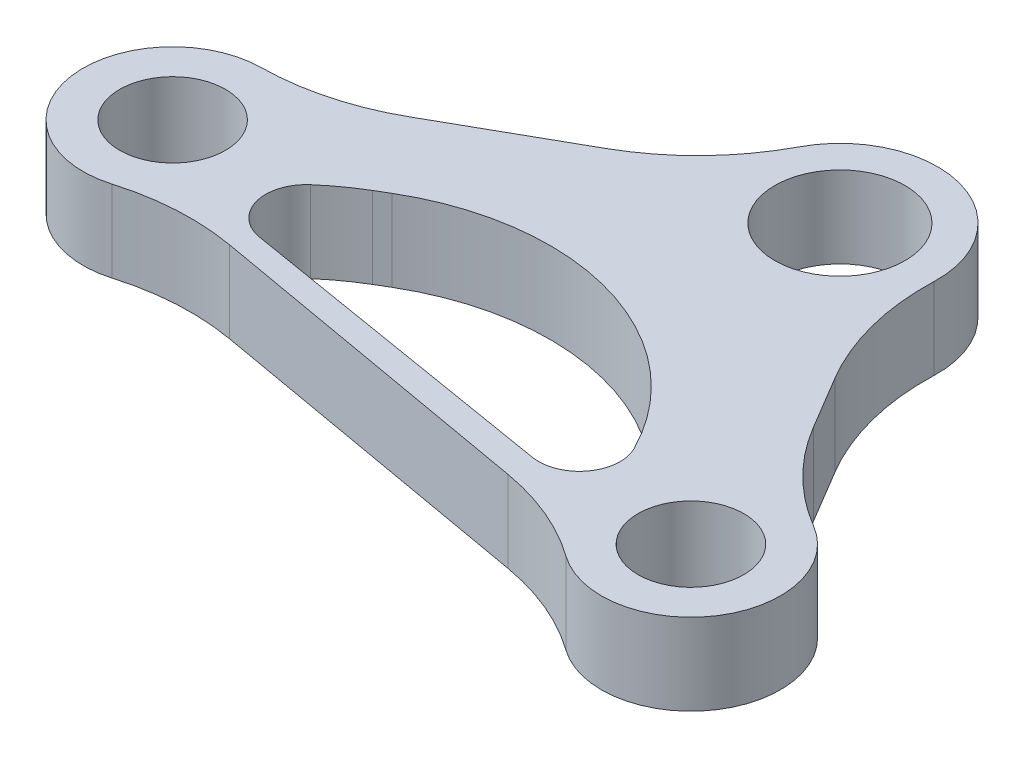
ISO-10303-21;
HEADER;
FILE_DESCRIPTION(('STEP AP214'),'2;1');
FILE_NAME('part.step','',(''),(''),'','','');
FILE_SCHEMA(('AUTOMOTIVE_DESIGN { 1 0 10303 214 1 1 1 1 }'));
ENDSEC;
DATA;
#1=APPLICATION_CONTEXT('core data for automotive mechanical design processes');
#2=APPLICATION_PROTOCOL_DEFINITION('international standard','automotive_design',2000,#1);
#3=PRODUCT_CONTEXT('',#1,'mechanical');
#4=PRODUCT('Part','Part','',(#3));
#5=PRODUCT_RELATED_PRODUCT_CATEGORY('part','',(#4));
#6=PRODUCT_DEFINITION_FORMATION('','',#4);
#7=PRODUCT_DEFINITION_CONTEXT('part definition',#1,'design');
#8=PRODUCT_DEFINITION('design','',#6,#7);
#9=PRODUCT_DEFINITION_SHAPE('','',#8);
#10=(LENGTH_UNIT() NAMED_UNIT(*) SI_UNIT(.MILLI.,.METRE.));
#11=(NAMED_UNIT(*) PLANE_ANGLE_UNIT() SI_UNIT($,.RADIAN.));
#12=(NAMED_UNIT(*) SI_UNIT($,.STERADIAN.) SOLID_ANGLE_UNIT());
#13=UNCERTAINTY_MEASURE_WITH_UNIT(LENGTH_MEASURE(1.E-05),#10,'distance_accuracy_value','');
#14=(GEOMETRIC_REPRESENTATION_CONTEXT(3) GLOBAL_UNCERTAINTY_ASSIGNED_CONTEXT((#13)) GLOBAL_UNIT_ASSIGNED_CONTEXT((#10,
#11,#12)) REPRESENTATION_CONTEXT('',''));
#15=CARTESIAN_POINT('',(0.,0.,0.));
#16=DIRECTION('',(0.,0.,1.));
#17=DIRECTION('',(1.,0.,0.));
#18=AXIS2_PLACEMENT_3D('',#15,#16,#17);
#19=CARTESIAN_POINT('',(39.2520973383795,10.,21.4894902294481));
#20=DIRECTION('',(0.,1.,0.));
#21=DIRECTION('',(0.,0.,1.));
#22=AXIS2_PLACEMENT_3D('',#19,#20,#21);
#23=PLANE('',#22);
#24=CARTESIAN_POINT('',(14.2520948776002,10.,-21.8117785390374));
#25=DIRECTION('',(0.,1.,0.));
#26=DIRECTION('',(0.,0.,1.));
#27=AXIS2_PLACEMENT_3D('',#24,#25,#26);
#28=CIRCLE('',#27,7.9999999999151);
#29=CARTESIAN_POINT('',(14.2520948776002,10.,-13.8117785391223));
#30=VERTEX_POINT('',#29);
#31=EDGE_CURVE('E623',#30,#30,#28,.T.);
#32=ORIENTED_EDGE('',*,*,#31,.F.);
#33=EDGE_LOOP('',(#32));
#34=FACE_BOUND('',#33,.T.);
#35=CARTESIAN_POINT('',(-1.16729566506993,10.,28.3650025181763));
#36=DIRECTION('',(0.,1.,0.));
#37=DIRECTION('',(0.,0.,1.));
#38=AXIS2_PLACEMENT_3D('',#35,#36,#37);
#39=CIRCLE('',#38,29.9999999994644);
#40=CARTESIAN_POINT('',(25.5899191802422,10.,14.7984460763347));
#41=VERTEX_POINT('',#40);
#42=CARTESIAN_POINT('',(-16.4342386361067,10.,2.54019947368099));
#43=VERTEX_POINT('',#42);
#44=EDGE_CURVE('E174',#41,#43,#39,.T.);
#45=ORIENTED_EDGE('',*,*,#44,.F.);
#46=CARTESIAN_POINT('',(21.130383372617,10.,17.0595388166787));
#47=DIRECTION('',(0.,1.,0.));
#48=DIRECTION('',(0.,0.,1.));
#49=AXIS2_PLACEMENT_3D('',#46,#47,#48);
#50=CIRCLE('',#49,4.99999999999279);
#51=CARTESIAN_POINT('',(20.3127049619111,10.,21.9922259156739));
#52=VERTEX_POINT('',#51);
#53=EDGE_CURVE('E165',#52,#41,#50,.T.);
#54=ORIENTED_EDGE('',*,*,#53,.F.);
#55=DIRECTION('',(0.986537419800459,0.,0.163535682141402));
#56=VECTOR('',#55,1.);
#57=CARTESIAN_POINT('',(20.3127049619111,10.,21.9922259156739));
#58=LINE('',#57,#56);
#59=CARTESIAN_POINT('',(-19.8914129584531,10.,15.327696302261));
#60=VERTEX_POINT('',#59);
#61=EDGE_CURVE('E202',#60,#52,#58,.T.);
#62=ORIENTED_EDGE('',*,*,#61,.F.);
#63=CARTESIAN_POINT('',(-19.0737345477473,10.,10.3950092032658));
#64=DIRECTION('',(0.,1.,0.));
#65=DIRECTION('',(0.,0.,1.));
#66=AXIS2_PLACEMENT_3D('',#63,#64,#65);
#67=CIRCLE('',#66,4.99999999999279);
#68=CARTESIAN_POINT('',(-22.3597920677756,10.,6.6264781930453));
#69=VERTEX_POINT('',#68);
#70=EDGE_CURVE('E199',#69,#60,#67,.T.);
#71=ORIENTED_EDGE('',*,*,#70,.F.);
#72=CARTESIAN_POINT('',(-2.64344694792927,10.,29.237664253997));
#73=DIRECTION('',(0.,1.,0.));
#74=DIRECTION('',(0.,0.,1.));
#75=AXIS2_PLACEMENT_3D('',#72,#73,#74);
#76=CIRCLE('',#75,29.9999999994644);
#77=CARTESIAN_POINT('',(-17.9103899189661,10.,3.4128612095017));
#78=VERTEX_POINT('',#77);
#79=EDGE_CURVE('E193',#78,#69,#76,.T.);
#80=ORIENTED_EDGE('',*,*,#79,.F.);
#81=DIRECTION('',(-0.860826768165212,0.,0.508898099043647));
#82=VECTOR('',#81,1.);
#83=CARTESIAN_POINT('',(-16.4342386361067,10.,2.54019947368101));
#84=LINE('',#83,#82);
#85=EDGE_CURVE('E189',#43,#78,#84,.T.);
#86=ORIENTED_EDGE('',*,*,#85,.F.);
#87=EDGE_LOOP('',(#45,#54,#62,#71,#80,#86));
#88=FACE_BOUND('',#87,.T.);
#89=CARTESIAN_POINT('',(39.2520973383795,10.,21.4894902294481));
#90=DIRECTION('',(0.,1.,0.));
#91=DIRECTION('',(0.,0.,1.));
#92=AXIS2_PLACEMENT_3D('',#89,#90,#91);
#93=CIRCLE('',#92,11.0000000000008);
#94=CARTESIAN_POINT('',(32.8589202459216,10.,30.4408748522028));
#95=VERTEX_POINT('',#94);
#96=CARTESIAN_POINT('',(44.8540194417173,10.,12.0227870679376));
#97=VERTEX_POINT('',#96);
#98=EDGE_CURVE('E237',#95,#97,#93,.T.);
#99=ORIENTED_EDGE('',*,*,#98,.T.);
#100=CARTESIAN_POINT('',(60.131988814183,10.,-13.7954942811737));
#101=DIRECTION('',(0.,-1.,0.));
#102=DIRECTION('',(0.,0.,1.));
#103=AXIS2_PLACEMENT_3D('',#100,#101,#102);
#104=CIRCLE('',#103,29.9999999994644);
#105=CARTESIAN_POINT('',(34.3608541908364,10.,1.56186943117008));
#106=VERTEX_POINT('',#105);
#107=EDGE_CURVE('E241',#97,#106,#104,.T.);
#108=ORIENTED_EDGE('',*,*,#107,.T.);
#109=DIRECTION('',(-0.51191212375393,0.,-0.859037820793556));
#110=VECTOR('',#109,1.);
#111=CARTESIAN_POINT('',(34.3608541908364,10.,1.56186943117008));
#112=LINE('',#111,#110);
#113=CARTESIAN_POINT('',(30.4554825745975,10.,-4.99172007556231));
#114=VERTEX_POINT('',#113);
#115=EDGE_CURVE('E245',#106,#114,#112,.T.);
#116=ORIENTED_EDGE('',*,*,#115,.T.);
#117=CARTESIAN_POINT('',(56.2266171979442,10.,-20.3490837879059));
#118=DIRECTION('',(0.,-1.,0.));
#119=DIRECTION('',(0.,0.,1.));
#120=AXIS2_PLACEMENT_3D('',#117,#118,#119);
#121=CIRCLE('',#120,29.9999999994644);
#122=CARTESIAN_POINT('',(26.2448155407173,10.,-21.3938657529942));
#123=VERTEX_POINT('',#122);
#124=EDGE_CURVE('E248',#114,#123,#121,.T.);
#125=ORIENTED_EDGE('',*,*,#124,.T.);
#126=CARTESIAN_POINT('',(14.2520948776002,10.,-21.8117785390374));
#127=DIRECTION('',(0.,1.,0.));
#128=DIRECTION('',(0.,0.,1.));
#129=AXIS2_PLACEMENT_3D('',#126,#127,#128);
#130=CIRCLE('',#129,12.0000000000123);
#131=CARTESIAN_POINT('',(3.64675509158938,10.,-27.4266487978725));
#132=VERTEX_POINT('',#131);
#133=EDGE_CURVE('E251',#123,#132,#130,.T.);
#134=ORIENTED_EDGE('',*,*,#133,.T.);
#135=CARTESIAN_POINT('',(-22.8665943729371,10.,-41.4638244446954));
#136=DIRECTION('',(0.,-1.,0.));
#137=DIRECTION('',(0.,0.,1.));
#138=AXIS2_PLACEMENT_3D('',#135,#136,#137);
#139=CIRCLE('',#138,29.9999999994644);
#140=CARTESIAN_POINT('',(-8.13512740407356,10.,-15.3298641456296));
#141=VERTEX_POINT('',#140);
#142=EDGE_CURVE('E254',#132,#141,#139,.T.);
#143=ORIENTED_EDGE('',*,*,#142,.T.);
#144=DIRECTION('',(-0.871132009984412,0.,0.491048898970885));
#145=VECTOR('',#144,1.);
#146=CARTESIAN_POINT('',(-8.13512740407356,10.,-15.3298641456296));
#147=LINE('',#146,#145);
#148=CARTESIAN_POINT('',(-23.4897269114671,10.,-6.67462120216413));
#149=VERTEX_POINT('',#148);
#150=EDGE_CURVE('E257',#141,#149,#147,.T.);
#151=ORIENTED_EDGE('',*,*,#150,.T.);
#152=CARTESIAN_POINT('',(-38.2211938803307,10.,-32.8085815012299));
#153=DIRECTION('',(0.,-1.,0.));
#154=DIRECTION('',(0.,0.,1.));
#155=AXIS2_PLACEMENT_3D('',#152,#153,#154);
#156=CIRCLE('',#155,29.9999999994644);
#157=CARTESIAN_POINT('',(-37.8467307807555,10.,-2.81091863635123));
#158=VERTEX_POINT('',#157);
#159=EDGE_CURVE('E260',#149,#158,#156,.T.);
#160=ORIENTED_EDGE('',*,*,#159,.T.);
#161=CARTESIAN_POINT('',(-37.7094276442421,10.,8.18822441430147));
#162=DIRECTION('',(0.,1.,0.));
#163=DIRECTION('',(0.,0.,1.));
#164=AXIS2_PLACEMENT_3D('',#161,#162,#163);
#165=CIRCLE('',#164,11.0000000000008);
#166=CARTESIAN_POINT('',(-34.607167770061,10.,18.7417064782017));
#167=VERTEX_POINT('',#166);
#168=EDGE_CURVE('E263',#158,#167,#165,.T.);
#169=ORIENTED_EDGE('',*,*,#168,.T.);
#170=CARTESIAN_POINT('',(-26.1464590224461,10.,47.5239302883227));
#171=DIRECTION('',(0.,-1.,0.));
#172=DIRECTION('',(0.,0.,1.));
#173=AXIS2_PLACEMENT_3D('',#170,#171,#172);
#174=CIRCLE('',#173,29.9999999994644);
#175=CARTESIAN_POINT('',(-20.9370153716465,10.,17.9796974024107));
#176=VERTEX_POINT('',#175);
#177=EDGE_CURVE('E266',#167,#176,#174,.T.);
#178=ORIENTED_EDGE('',*,*,#177,.T.);
#179=DIRECTION('',(0.984807762881317,0.,0.173648121696422));
#180=VECTOR('',#179,1.);
#181=CARTESIAN_POINT('',(-20.9370153716465,10.,17.9796974024107));
#182=LINE('',#181,#180);
#183=CARTESIAN_POINT('',(20.6324263721488,10.,25.3095091188206));
#184=VERTEX_POINT('',#183);
#185=EDGE_CURVE('E269',#176,#184,#182,.T.);
#186=ORIENTED_EDGE('',*,*,#185,.T.);
#187=CARTESIAN_POINT('',(15.4229827213491,10.,54.8537420047326));
#188=DIRECTION('',(0.,-1.,0.));
#189=DIRECTION('',(0.,0.,1.));
#190=AXIS2_PLACEMENT_3D('',#187,#188,#189);
#191=CIRCLE('',#190,29.9999999994644);
#192=EDGE_CURVE('E272',#184,#95,#191,.T.);
#193=ORIENTED_EDGE('',*,*,#192,.T.);
#194=EDGE_LOOP('',(#99,#108,#116,#125,#134,#143,#151,#160,#169,#178,#186,#193));
#195=FACE_BOUND('',#194,.T.);
#196=CARTESIAN_POINT('',(-37.7094276442421,10.,8.18822441430146));
#197=DIRECTION('',(0.,1.,0.));
#198=DIRECTION('',(0.,0.,1.));
#199=AXIS2_PLACEMENT_3D('',#196,#197,#198);
#200=CIRCLE('',#199,6.49999999975905);
#201=CARTESIAN_POINT('',(-37.7094276442421,10.,14.6882244140605));
#202=VERTEX_POINT('',#201);
#203=EDGE_CURVE('E207',#202,#202,#200,.T.);
#204=ORIENTED_EDGE('',*,*,#203,.F.);
#205=EDGE_LOOP('',(#204));
#206=FACE_BOUND('',#205,.T.);
#207=CARTESIAN_POINT('',(39.2520973383795,10.,21.4894902294481));
#208=DIRECTION('',(0.,1.,0.));
#209=DIRECTION('',(0.,0.,1.));
#210=AXIS2_PLACEMENT_3D('',#207,#208,#209);
#211=CIRCLE('',#210,6.50000000022621);
#212=CARTESIAN_POINT('',(39.2520973383795,10.,27.9894902296743));
#213=VERTEX_POINT('',#212);
#214=EDGE_CURVE('E612',#213,#213,#211,.T.);
#215=ORIENTED_EDGE('',*,*,#214,.F.);
#216=EDGE_LOOP('',(#215));
#217=FACE_BOUND('',#216,.T.);
#218=ADVANCED_FACE('F39',(#34,#88,#195,#206,#217),#23,.T.);
#219=CARTESIAN_POINT('',(39.2520973383795,0.,21.4894902294481));
#220=DIRECTION('',(0.,1.,0.));
#221=DIRECTION('',(0.,0.,1.));
#222=AXIS2_PLACEMENT_3D('',#219,#220,#221);
#223=PLANE('',#222);
#224=CARTESIAN_POINT('',(39.2520973383795,0.,21.4894902294481));
#225=DIRECTION('',(0.,1.,0.));
#226=DIRECTION('',(0.,0.,1.));
#227=AXIS2_PLACEMENT_3D('',#224,#225,#226);
#228=CIRCLE('',#227,11.0000000000008);
#229=CARTESIAN_POINT('',(32.8589202459216,0.,30.4408748522028));
#230=VERTEX_POINT('',#229);
#231=CARTESIAN_POINT('',(44.8540194417173,0.,12.0227870679376));
#232=VERTEX_POINT('',#231);
#233=EDGE_CURVE('E183',#230,#232,#228,.T.);
#234=ORIENTED_EDGE('',*,*,#233,.F.);
#235=CARTESIAN_POINT('',(15.4229827213491,0.,54.8537420047326));
#236=DIRECTION('',(0.,-1.,0.));
#237=DIRECTION('',(0.,0.,1.));
#238=AXIS2_PLACEMENT_3D('',#235,#236,#237);
#239=CIRCLE('',#238,29.9999999994644);
#240=CARTESIAN_POINT('',(20.6324263721488,0.,25.3095091188206));
#241=VERTEX_POINT('',#240);
#242=EDGE_CURVE('E242',#241,#230,#239,.T.);
#243=ORIENTED_EDGE('',*,*,#242,.F.);
#244=DIRECTION('',(0.984807762881317,0.,0.173648121696422));
#245=VECTOR('',#244,1.);
#246=CARTESIAN_POINT('',(-20.9370153716465,0.,17.9796974024107));
#247=LINE('',#246,#245);
#248=CARTESIAN_POINT('',(-20.9370153716465,0.,17.9796974024107));
#249=VERTEX_POINT('',#248);
#250=EDGE_CURVE('E306',#249,#241,#247,.T.);
#251=ORIENTED_EDGE('',*,*,#250,.F.);
#252=CARTESIAN_POINT('',(-26.1464590224461,0.,47.5239302883227));
#253=DIRECTION('',(0.,-1.,0.));
#254=DIRECTION('',(0.,0.,1.));
#255=AXIS2_PLACEMENT_3D('',#252,#253,#254);
#256=CIRCLE('',#255,29.9999999994644);
#257=CARTESIAN_POINT('',(-34.607167770061,0.,18.7417064782017));
#258=VERTEX_POINT('',#257);
#259=EDGE_CURVE('E303',#258,#249,#256,.T.);
#260=ORIENTED_EDGE('',*,*,#259,.F.);
#261=CARTESIAN_POINT('',(-37.7094276442421,0.,8.18822441430147));
#262=DIRECTION('',(0.,1.,0.));
#263=DIRECTION('',(0.,0.,1.));
#264=AXIS2_PLACEMENT_3D('',#261,#262,#263);
#265=CIRCLE('',#264,11.0000000000008);
#266=CARTESIAN_POINT('',(-37.8467307807555,0.,-2.81091863635123));
#267=VERTEX_POINT('',#266);
#268=EDGE_CURVE('E300',#267,#258,#265,.T.);
#269=ORIENTED_EDGE('',*,*,#268,.F.);
#270=CARTESIAN_POINT('',(-38.2211938803307,0.,-32.8085815012299));
#271=DIRECTION('',(0.,-1.,0.));
#272=DIRECTION('',(0.,0.,1.));
#273=AXIS2_PLACEMENT_3D('',#270,#271,#272);
#274=CIRCLE('',#273,29.9999999994644);
#275=CARTESIAN_POINT('',(-23.4897269114671,0.,-6.67462120216413));
#276=VERTEX_POINT('',#275);
#277=EDGE_CURVE('E297',#276,#267,#274,.T.);
#278=ORIENTED_EDGE('',*,*,#277,.F.);
#279=DIRECTION('',(-0.871132009984412,0.,0.491048898970885));
#280=VECTOR('',#279,1.);
#281=CARTESIAN_POINT('',(-8.13512740407356,0.,-15.3298641456296));
#282=LINE('',#281,#280);
#283=CARTESIAN_POINT('',(-8.13512740407356,0.,-15.3298641456296));
#284=VERTEX_POINT('',#283);
#285=EDGE_CURVE('E294',#284,#276,#282,.T.);
#286=ORIENTED_EDGE('',*,*,#285,.F.);
#287=CARTESIAN_POINT('',(-22.8665943729371,0.,-41.4638244446954));
#288=DIRECTION('',(0.,-1.,0.));
#289=DIRECTION('',(0.,0.,1.));
#290=AXIS2_PLACEMENT_3D('',#287,#288,#289);
#291=CIRCLE('',#290,29.9999999994644);
#292=CARTESIAN_POINT('',(3.64675509158938,0.,-27.4266487978725));
#293=VERTEX_POINT('',#292);
#294=EDGE_CURVE('E291',#293,#284,#291,.T.);
#295=ORIENTED_EDGE('',*,*,#294,.F.);
#296=CARTESIAN_POINT('',(14.2520948776002,0.,-21.8117785390374));
#297=DIRECTION('',(0.,1.,0.));
#298=DIRECTION('',(0.,0.,1.));
#299=AXIS2_PLACEMENT_3D('',#296,#297,#298);
#300=CIRCLE('',#299,12.0000000000123);
#301=CARTESIAN_POINT('',(26.2448155407173,0.,-21.3938657529942));
#302=VERTEX_POINT('',#301);
#303=EDGE_CURVE('E288',#302,#293,#300,.T.);
#304=ORIENTED_EDGE('',*,*,#303,.F.);
#305=CARTESIAN_POINT('',(56.2266171979442,0.,-20.3490837879059));
#306=DIRECTION('',(0.,-1.,0.));
#307=DIRECTION('',(0.,0.,1.));
#308=AXIS2_PLACEMENT_3D('',#305,#306,#307);
#309=CIRCLE('',#308,29.9999999994644);
#310=CARTESIAN_POINT('',(30.4554825745975,0.,-4.99172007556231));
#311=VERTEX_POINT('',#310);
#312=EDGE_CURVE('E285',#311,#302,#309,.T.);
#313=ORIENTED_EDGE('',*,*,#312,.F.);
#314=DIRECTION('',(-0.51191212375393,0.,-0.859037820793556));
#315=VECTOR('',#314,1.);
#316=CARTESIAN_POINT('',(34.3608541908364,0.,1.56186943117008));
#317=LINE('',#316,#315);
#318=CARTESIAN_POINT('',(34.3608541908364,0.,1.56186943117008));
#319=VERTEX_POINT('',#318);
#320=EDGE_CURVE('E282',#319,#311,#317,.T.);
#321=ORIENTED_EDGE('',*,*,#320,.F.);
#322=CARTESIAN_POINT('',(60.131988814183,0.,-13.7954942811737));
#323=DIRECTION('',(0.,-1.,0.));
#324=DIRECTION('',(0.,0.,1.));
#325=AXIS2_PLACEMENT_3D('',#322,#323,#324);
#326=CIRCLE('',#325,29.9999999994644);
#327=EDGE_CURVE('E279',#232,#319,#326,.T.);
#328=ORIENTED_EDGE('',*,*,#327,.F.);
#329=EDGE_LOOP('',(#234,#243,#251,#260,#269,#278,#286,#295,#304,#313,#321,#328));
#330=FACE_BOUND('',#329,.T.);
#331=CARTESIAN_POINT('',(21.130383372617,0.,17.0595388166787));
#332=DIRECTION('',(0.,1.,0.));
#333=DIRECTION('',(0.,0.,1.));
#334=AXIS2_PLACEMENT_3D('',#331,#332,#333);
#335=CIRCLE('',#334,4.99999999999279);
#336=CARTESIAN_POINT('',(20.3127049619111,0.,21.9922259156739));
#337=VERTEX_POINT('',#336);
#338=CARTESIAN_POINT('',(25.5899191802422,0.,14.7984460763347));
#339=VERTEX_POINT('',#338);
#340=EDGE_CURVE('E63',#337,#339,#335,.T.);
#341=ORIENTED_EDGE('',*,*,#340,.T.);
#342=CARTESIAN_POINT('',(-1.16729566506993,0.,28.3650025181763));
#343=DIRECTION('',(0.,1.,0.));
#344=DIRECTION('',(0.,0.,1.));
#345=AXIS2_PLACEMENT_3D('',#342,#343,#344);
#346=CIRCLE('',#345,29.9999999994644);
#347=CARTESIAN_POINT('',(-16.4342386361067,0.,2.54019947368099));
#348=VERTEX_POINT('',#347);
#349=EDGE_CURVE('E181',#339,#348,#346,.T.);
#350=ORIENTED_EDGE('',*,*,#349,.T.);
#351=DIRECTION('',(-0.860826768165212,0.,0.508898099043647));
#352=VECTOR('',#351,1.);
#353=CARTESIAN_POINT('',(-16.4342386361067,0.,2.54019947368101));
#354=LINE('',#353,#352);
#355=CARTESIAN_POINT('',(-17.9103899189661,0.,3.4128612095017));
#356=VERTEX_POINT('',#355);
#357=EDGE_CURVE('E210',#348,#356,#354,.T.);
#358=ORIENTED_EDGE('',*,*,#357,.T.);
#359=CARTESIAN_POINT('',(-2.64344694792927,0.,29.237664253997));
#360=DIRECTION('',(0.,1.,0.));
#361=DIRECTION('',(0.,0.,1.));
#362=AXIS2_PLACEMENT_3D('',#359,#360,#361);
#363=CIRCLE('',#362,29.9999999994644);
#364=CARTESIAN_POINT('',(-22.3597920677756,0.,6.6264781930453));
#365=VERTEX_POINT('',#364);
#366=EDGE_CURVE('E214',#356,#365,#363,.T.);
#367=ORIENTED_EDGE('',*,*,#366,.T.);
#368=CARTESIAN_POINT('',(-19.0737345477473,0.,10.3950092032658));
#369=DIRECTION('',(0.,1.,0.));
#370=DIRECTION('',(0.,0.,1.));
#371=AXIS2_PLACEMENT_3D('',#368,#369,#370);
#372=CIRCLE('',#371,4.99999999999279);
#373=CARTESIAN_POINT('',(-19.8914129584531,0.,15.3276963022609));
#374=VERTEX_POINT('',#373);
#375=EDGE_CURVE('E218',#365,#374,#372,.T.);
#376=ORIENTED_EDGE('',*,*,#375,.T.);
#377=DIRECTION('',(0.986537419800459,0.,0.163535682141402));
#378=VECTOR('',#377,1.);
#379=CARTESIAN_POINT('',(20.3127049619111,0.,21.9922259156739));
#380=LINE('',#379,#378);
#381=EDGE_CURVE('E175',#374,#337,#380,.T.);
#382=ORIENTED_EDGE('',*,*,#381,.T.);
#383=EDGE_LOOP('',(#341,#350,#358,#367,#376,#382));
#384=FACE_BOUND('',#383,.T.);
#385=CARTESIAN_POINT('',(-37.7094276442421,0.,8.18822441430146));
#386=DIRECTION('',(0.,1.,0.));
#387=DIRECTION('',(0.,0.,1.));
#388=AXIS2_PLACEMENT_3D('',#385,#386,#387);
#389=CIRCLE('',#388,6.49999999975905);
#390=CARTESIAN_POINT('',(-37.7094276442421,0.,14.6882244140605));
#391=VERTEX_POINT('',#390);
#392=EDGE_CURVE('E627',#391,#391,#389,.T.);
#393=ORIENTED_EDGE('',*,*,#392,.T.);
#394=EDGE_LOOP('',(#393));
#395=FACE_BOUND('',#394,.T.);
#396=CARTESIAN_POINT('',(14.2520948776002,0.,-21.8117785390374));
#397=DIRECTION('',(0.,1.,0.));
#398=DIRECTION('',(0.,0.,1.));
#399=AXIS2_PLACEMENT_3D('',#396,#397,#398);
#400=CIRCLE('',#399,7.9999999999151);
#401=CARTESIAN_POINT('',(14.2520948776002,0.,-13.8117785391223));
#402=VERTEX_POINT('',#401);
#403=EDGE_CURVE('E620',#402,#402,#400,.T.);
#404=ORIENTED_EDGE('',*,*,#403,.T.);
#405=EDGE_LOOP('',(#404));
#406=FACE_BOUND('',#405,.T.);
#407=CARTESIAN_POINT('',(39.2520973383795,0.,21.4894902294481));
#408=DIRECTION('',(0.,1.,0.));
#409=DIRECTION('',(0.,0.,1.));
#410=AXIS2_PLACEMENT_3D('',#407,#408,#409);
#411=CIRCLE('',#410,6.50000000022621);
#412=CARTESIAN_POINT('',(39.2520973383795,0.,27.9894902296743));
#413=VERTEX_POINT('',#412);
#414=EDGE_CURVE('E615',#413,#413,#411,.T.);
#415=ORIENTED_EDGE('',*,*,#414,.T.);
#416=EDGE_LOOP('',(#415));
#417=FACE_BOUND('',#416,.T.);
#418=ADVANCED_FACE('F361',(#330,#384,#395,#406,#417),#223,.F.);
#419=CARTESIAN_POINT('',(39.2520973383795,10.,21.4894902294481));
#420=DIRECTION('',(0.,-1.,0.));
#421=DIRECTION('',(0.,0.,-1.));
#422=AXIS2_PLACEMENT_3D('',#419,#420,#421);
#423=CYLINDRICAL_SURFACE('',#422,11.0000000000008);
#424=ORIENTED_EDGE('',*,*,#233,.T.);
#425=DIRECTION('',(0.,-1.,0.));
#426=VECTOR('',#425,1.);
#427=CARTESIAN_POINT('',(44.8540194417173,10.,12.0227870679376));
#428=LINE('',#427,#426);
#429=EDGE_CURVE('E11',#97,#232,#428,.T.);
#430=ORIENTED_EDGE('',*,*,#429,.F.);
#431=ORIENTED_EDGE('',*,*,#98,.F.);
#432=DIRECTION('',(0.,-1.,0.));
#433=VECTOR('',#432,1.);
#434=CARTESIAN_POINT('',(32.8589202459216,10.,30.4408748522028));
#435=LINE('',#434,#433);
#436=EDGE_CURVE('E275',#95,#230,#435,.T.);
#437=ORIENTED_EDGE('',*,*,#436,.T.);
#438=EDGE_LOOP('',(#424,#430,#431,#437));
#439=FACE_BOUND('',#438,.T.);
#440=ADVANCED_FACE('F41',(#439),#423,.T.);
#441=CARTESIAN_POINT('',(60.131988814183,10.,-13.7954942811737));
#442=DIRECTION('',(0.,-1.,0.));
#443=DIRECTION('',(0.,0.,-1.));
#444=AXIS2_PLACEMENT_3D('',#441,#442,#443);
#445=CYLINDRICAL_SURFACE('',#444,29.9999999994644);
#446=ORIENTED_EDGE('',*,*,#327,.T.);
#447=DIRECTION('',(0.,-1.,0.));
#448=VECTOR('',#447,1.);
#449=CARTESIAN_POINT('',(34.3608541908364,10.,1.56186943117008));
#450=LINE('',#449,#448);
#451=EDGE_CURVE('E48',#106,#319,#450,.T.);
#452=ORIENTED_EDGE('',*,*,#451,.F.);
#453=ORIENTED_EDGE('',*,*,#107,.F.);
#454=ORIENTED_EDGE('',*,*,#429,.T.);
#455=EDGE_LOOP('',(#446,#452,#453,#454));
#456=FACE_BOUND('',#455,.T.);
#457=ADVANCED_FACE('F378',(#456),#445,.F.);
#458=CARTESIAN_POINT('',(34.3608541908364,10.,1.56186943117008));
#459=DIRECTION('',(-0.859037820793556,0.,0.51191212375393));
#460=DIRECTION('',(0.51191212375393,0.,0.859037820793556));
#461=AXIS2_PLACEMENT_3D('',#458,#459,#460);
#462=PLANE('',#461);
#463=ORIENTED_EDGE('',*,*,#320,.T.);
#464=DIRECTION('',(0.,-1.,0.));
#465=VECTOR('',#464,1.);
#466=CARTESIAN_POINT('',(30.4554825745975,10.,-4.99172007556231));
#467=LINE('',#466,#465);
#468=EDGE_CURVE('E346',#114,#311,#467,.T.);
#469=ORIENTED_EDGE('',*,*,#468,.F.);
#470=ORIENTED_EDGE('',*,*,#115,.F.);
#471=ORIENTED_EDGE('',*,*,#451,.T.);
#472=EDGE_LOOP('',(#463,#469,#470,#471));
#473=FACE_BOUND('',#472,.T.);
#474=ADVANCED_FACE('F355',(#473),#462,.F.);
#475=CARTESIAN_POINT('',(56.2266171979442,10.,-20.3490837879059));
#476=DIRECTION('',(0.,-1.,0.));
#477=DIRECTION('',(0.,0.,-1.));
#478=AXIS2_PLACEMENT_3D('',#475,#476,#477);
#479=CYLINDRICAL_SURFACE('',#478,29.9999999994644);
#480=ORIENTED_EDGE('',*,*,#312,.T.);
#481=DIRECTION('',(0.,-1.,0.));
#482=VECTOR('',#481,1.);
#483=CARTESIAN_POINT('',(26.2448155407173,10.,-21.3938657529942));
#484=LINE('',#483,#482);
#485=EDGE_CURVE('E342',#123,#302,#484,.T.);
#486=ORIENTED_EDGE('',*,*,#485,.F.);
#487=ORIENTED_EDGE('',*,*,#124,.F.);
#488=ORIENTED_EDGE('',*,*,#468,.T.);
#489=EDGE_LOOP('',(#480,#486,#487,#488));
#490=FACE_BOUND('',#489,.T.);
#491=ADVANCED_FACE('F367',(#490),#479,.F.);
#492=CARTESIAN_POINT('',(14.2520948776002,10.,-21.8117785390374));
#493=DIRECTION('',(0.,-1.,0.));
#494=DIRECTION('',(0.,0.,-1.));
#495=AXIS2_PLACEMENT_3D('',#492,#493,#494);
#496=CYLINDRICAL_SURFACE('',#495,12.0000000000123);
#497=ORIENTED_EDGE('',*,*,#303,.T.);
#498=DIRECTION('',(0.,-1.,0.));
#499=VECTOR('',#498,1.);
#500=CARTESIAN_POINT('',(3.64675509158938,10.,-27.4266487978725));
#501=LINE('',#500,#499);
#502=EDGE_CURVE('E338',#132,#293,#501,.T.);
#503=ORIENTED_EDGE('',*,*,#502,.F.);
#504=ORIENTED_EDGE('',*,*,#133,.F.);
#505=ORIENTED_EDGE('',*,*,#485,.T.);
#506=EDGE_LOOP('',(#497,#503,#504,#505));
#507=FACE_BOUND('',#506,.T.);
#508=ADVANCED_FACE('F371',(#507),#496,.T.);
#509=CARTESIAN_POINT('',(-22.8665943729371,10.,-41.4638244446954));
#510=DIRECTION('',(0.,-1.,0.));
#511=DIRECTION('',(0.,0.,-1.));
#512=AXIS2_PLACEMENT_3D('',#509,#510,#511);
#513=CYLINDRICAL_SURFACE('',#512,29.9999999994644);
#514=ORIENTED_EDGE('',*,*,#294,.T.);
#515=DIRECTION('',(0.,-1.,0.));
#516=VECTOR('',#515,1.);
#517=CARTESIAN_POINT('',(-8.13512740407356,10.,-15.3298641456296));
#518=LINE('',#517,#516);
#519=EDGE_CURVE('E334',#141,#284,#518,.T.);
#520=ORIENTED_EDGE('',*,*,#519,.F.);
#521=ORIENTED_EDGE('',*,*,#142,.F.);
#522=ORIENTED_EDGE('',*,*,#502,.T.);
#523=EDGE_LOOP('',(#514,#520,#521,#522));
#524=FACE_BOUND('',#523,.T.);
#525=ADVANCED_FACE('F411',(#524),#513,.F.);
#526=CARTESIAN_POINT('',(-8.13512740407356,10.,-15.3298641456296));
#527=DIRECTION('',(0.491048898970885,0.,0.871132009984412));
#528=DIRECTION('',(0.871132009984412,0.,-0.491048898970885));
#529=AXIS2_PLACEMENT_3D('',#526,#527,#528);
#530=PLANE('',#529);
#531=ORIENTED_EDGE('',*,*,#285,.T.);
#532=DIRECTION('',(0.,-1.,0.));
#533=VECTOR('',#532,1.);
#534=CARTESIAN_POINT('',(-23.4897269114671,10.,-6.67462120216413));
#535=LINE('',#534,#533);
#536=EDGE_CURVE('E330',#149,#276,#535,.T.);
#537=ORIENTED_EDGE('',*,*,#536,.F.);
#538=ORIENTED_EDGE('',*,*,#150,.F.);
#539=ORIENTED_EDGE('',*,*,#519,.T.);
#540=EDGE_LOOP('',(#531,#537,#538,#539));
#541=FACE_BOUND('',#540,.T.);
#542=ADVANCED_FACE('F409',(#541),#530,.F.);
#543=CARTESIAN_POINT('',(-38.2211938803307,10.,-32.8085815012299));
#544=DIRECTION('',(0.,-1.,0.));
#545=DIRECTION('',(0.,0.,-1.));
#546=AXIS2_PLACEMENT_3D('',#543,#544,#545);
#547=CYLINDRICAL_SURFACE('',#546,29.9999999994644);
#548=ORIENTED_EDGE('',*,*,#277,.T.);
#549=DIRECTION('',(0.,-1.,0.));
#550=VECTOR('',#549,1.);
#551=CARTESIAN_POINT('',(-37.8467307807555,10.,-2.81091863635123));
#552=LINE('',#551,#550);
#553=EDGE_CURVE('E326',#158,#267,#552,.T.);
#554=ORIENTED_EDGE('',*,*,#553,.F.);
#555=ORIENTED_EDGE('',*,*,#159,.F.);
#556=ORIENTED_EDGE('',*,*,#536,.T.);
#557=EDGE_LOOP('',(#548,#554,#555,#556));
#558=FACE_BOUND('',#557,.T.);
#559=ADVANCED_FACE('F405',(#558),#547,.F.);
#560=CARTESIAN_POINT('',(-37.7094276442421,10.,8.18822441430147));
#561=DIRECTION('',(0.,-1.,0.));
#562=DIRECTION('',(0.,0.,-1.));
#563=AXIS2_PLACEMENT_3D('',#560,#561,#562);
#564=CYLINDRICAL_SURFACE('',#563,11.0000000000008);
#565=ORIENTED_EDGE('',*,*,#268,.T.);
#566=DIRECTION('',(0.,-1.,0.));
#567=VECTOR('',#566,1.);
#568=CARTESIAN_POINT('',(-34.607167770061,10.,18.7417064782017));
#569=LINE('',#568,#567);
#570=EDGE_CURVE('E322',#167,#258,#569,.T.);
#571=ORIENTED_EDGE('',*,*,#570,.F.);
#572=ORIENTED_EDGE('',*,*,#168,.F.);
#573=ORIENTED_EDGE('',*,*,#553,.T.);
#574=EDGE_LOOP('',(#565,#571,#572,#573));
#575=FACE_BOUND('',#574,.T.);
#576=ADVANCED_FACE('F400',(#575),#564,.T.);
#577=CARTESIAN_POINT('',(-26.1464590224461,10.,47.5239302883227));
#578=DIRECTION('',(0.,-1.,0.));
#579=DIRECTION('',(0.,0.,-1.));
#580=AXIS2_PLACEMENT_3D('',#577,#578,#579);
#581=CYLINDRICAL_SURFACE('',#580,29.9999999994644);
#582=ORIENTED_EDGE('',*,*,#259,.T.);
#583=DIRECTION('',(0.,-1.,0.));
#584=VECTOR('',#583,1.);
#585=CARTESIAN_POINT('',(-20.9370153716465,10.,17.9796974024107));
#586=LINE('',#585,#584);
#587=EDGE_CURVE('E318',#176,#249,#586,.T.);
#588=ORIENTED_EDGE('',*,*,#587,.F.);
#589=ORIENTED_EDGE('',*,*,#177,.F.);
#590=ORIENTED_EDGE('',*,*,#570,.T.);
#591=EDGE_LOOP('',(#582,#588,#589,#590));
#592=FACE_BOUND('',#591,.T.);
#593=ADVANCED_FACE('F394',(#592),#581,.F.);
#594=CARTESIAN_POINT('',(-20.9370153716465,10.,17.9796974024107));
#595=DIRECTION('',(0.173648121696422,0.,-0.984807762881317));
#596=DIRECTION('',(-0.984807762881317,0.,-0.173648121696422));
#597=AXIS2_PLACEMENT_3D('',#594,#595,#596);
#598=PLANE('',#597);
#599=ORIENTED_EDGE('',*,*,#250,.T.);
#600=DIRECTION('',(0.,-1.,0.));
#601=VECTOR('',#600,1.);
#602=CARTESIAN_POINT('',(20.6324263721488,10.,25.3095091188206));
#603=LINE('',#602,#601);
#604=EDGE_CURVE('E314',#184,#241,#603,.T.);
#605=ORIENTED_EDGE('',*,*,#604,.F.);
#606=ORIENTED_EDGE('',*,*,#185,.F.);
#607=ORIENTED_EDGE('',*,*,#587,.T.);
#608=EDGE_LOOP('',(#599,#605,#606,#607));
#609=FACE_BOUND('',#608,.T.);
#610=ADVANCED_FACE('F390',(#609),#598,.F.);
#611=CARTESIAN_POINT('',(15.4229827213491,10.,54.8537420047326));
#612=DIRECTION('',(0.,-1.,0.));
#613=DIRECTION('',(0.,0.,-1.));
#614=AXIS2_PLACEMENT_3D('',#611,#612,#613);
#615=CYLINDRICAL_SURFACE('',#614,29.9999999994644);
#616=ORIENTED_EDGE('',*,*,#242,.T.);
#617=ORIENTED_EDGE('',*,*,#436,.F.);
#618=ORIENTED_EDGE('',*,*,#192,.F.);
#619=ORIENTED_EDGE('',*,*,#604,.T.);
#620=EDGE_LOOP('',(#616,#617,#618,#619));
#621=FACE_BOUND('',#620,.T.);
#622=ADVANCED_FACE('F385',(#621),#615,.F.);
#623=CARTESIAN_POINT('',(21.130383372617,10.,17.0595388166787));
#624=DIRECTION('',(0.,-1.,0.));
#625=DIRECTION('',(0.,0.,-1.));
#626=AXIS2_PLACEMENT_3D('',#623,#624,#625);
#627=CYLINDRICAL_SURFACE('',#626,4.99999999999279);
#628=ORIENTED_EDGE('',*,*,#340,.F.);
#629=DIRECTION('',(0.,-1.,0.));
#630=VECTOR('',#629,1.);
#631=CARTESIAN_POINT('',(20.3127049619111,10.,21.9922259156739));
#632=LINE('',#631,#630);
#633=EDGE_CURVE('E169',#52,#337,#632,.T.);
#634=ORIENTED_EDGE('',*,*,#633,.F.);
#635=ORIENTED_EDGE('',*,*,#53,.T.);
#636=DIRECTION('',(0.,-1.,0.));
#637=VECTOR('',#636,1.);
#638=CARTESIAN_POINT('',(25.5899191802422,10.,14.7984460763347));
#639=LINE('',#638,#637);
#640=EDGE_CURVE('E168',#41,#339,#639,.T.);
#641=ORIENTED_EDGE('',*,*,#640,.T.);
#642=EDGE_LOOP('',(#628,#634,#635,#641));
#643=FACE_BOUND('',#642,.T.);
#644=ADVANCED_FACE('F167',(#643),#627,.F.);
#645=CARTESIAN_POINT('',(-1.16729566506993,10.,28.3650025181763));
#646=DIRECTION('',(0.,-1.,0.));
#647=DIRECTION('',(0.,0.,-1.));
#648=AXIS2_PLACEMENT_3D('',#645,#646,#647);
#649=CYLINDRICAL_SURFACE('',#648,29.9999999994644);
#650=ORIENTED_EDGE('',*,*,#349,.F.);
#651=ORIENTED_EDGE('',*,*,#640,.F.);
#652=ORIENTED_EDGE('',*,*,#44,.T.);
#653=DIRECTION('',(0.,-1.,0.));
#654=VECTOR('',#653,1.);
#655=CARTESIAN_POINT('',(-16.4342386361067,10.,2.54019947368099));
#656=LINE('',#655,#654);
#657=EDGE_CURVE('E184',#43,#348,#656,.T.);
#658=ORIENTED_EDGE('',*,*,#657,.T.);
#659=EDGE_LOOP('',(#650,#651,#652,#658));
#660=FACE_BOUND('',#659,.T.);
#661=ADVANCED_FACE('F178',(#660),#649,.F.);
#662=CARTESIAN_POINT('',(-16.4342386361067,10.,2.54019947368101));
#663=DIRECTION('',(0.508898099043647,0.,0.860826768165212));
#664=DIRECTION('',(0.860826768165212,0.,-0.508898099043647));
#665=AXIS2_PLACEMENT_3D('',#662,#663,#664);
#666=PLANE('',#665);
#667=ORIENTED_EDGE('',*,*,#357,.F.);
#668=ORIENTED_EDGE('',*,*,#657,.F.);
#669=ORIENTED_EDGE('',*,*,#85,.T.);
#670=DIRECTION('',(0.,-1.,0.));
#671=VECTOR('',#670,1.);
#672=CARTESIAN_POINT('',(-17.9103899189661,10.,3.4128612095017));
#673=LINE('',#672,#671);
#674=EDGE_CURVE('E232',#78,#356,#673,.T.);
#675=ORIENTED_EDGE('',*,*,#674,.T.);
#676=EDGE_LOOP('',(#667,#668,#669,#675));
#677=FACE_BOUND('',#676,.T.);
#678=ADVANCED_FACE('F471',(#677),#666,.T.);
#679=CARTESIAN_POINT('',(-2.64344694792927,10.,29.237664253997));
#680=DIRECTION('',(0.,-1.,0.));
#681=DIRECTION('',(0.,0.,-1.));
#682=AXIS2_PLACEMENT_3D('',#679,#680,#681);
#683=CYLINDRICAL_SURFACE('',#682,29.9999999994644);
#684=ORIENTED_EDGE('',*,*,#366,.F.);
#685=ORIENTED_EDGE('',*,*,#674,.F.);
#686=ORIENTED_EDGE('',*,*,#79,.T.);
#687=DIRECTION('',(0.,-1.,0.));
#688=VECTOR('',#687,1.);
#689=CARTESIAN_POINT('',(-22.3597920677756,10.,6.6264781930453));
#690=LINE('',#689,#688);
#691=EDGE_CURVE('E229',#69,#365,#690,.T.);
#692=ORIENTED_EDGE('',*,*,#691,.T.);
#693=EDGE_LOOP('',(#684,#685,#686,#692));
#694=FACE_BOUND('',#693,.T.);
#695=ADVANCED_FACE('F477',(#694),#683,.F.);
#696=CARTESIAN_POINT('',(-19.0737345477473,10.,10.3950092032658));
#697=DIRECTION('',(0.,-1.,0.));
#698=DIRECTION('',(0.,0.,-1.));
#699=AXIS2_PLACEMENT_3D('',#696,#697,#698);
#700=CYLINDRICAL_SURFACE('',#699,4.99999999999279);
#701=ORIENTED_EDGE('',*,*,#375,.F.);
#702=ORIENTED_EDGE('',*,*,#691,.F.);
#703=ORIENTED_EDGE('',*,*,#70,.T.);
#704=DIRECTION('',(0.,-1.,0.));
#705=VECTOR('',#704,1.);
#706=CARTESIAN_POINT('',(-19.8914129584531,10.,15.3276963022609));
#707=LINE('',#706,#705);
#708=EDGE_CURVE('E55',#60,#374,#707,.T.);
#709=ORIENTED_EDGE('',*,*,#708,.T.);
#710=EDGE_LOOP('',(#701,#702,#703,#709));
#711=FACE_BOUND('',#710,.T.);
#712=ADVANCED_FACE('F485',(#711),#700,.F.);
#713=CARTESIAN_POINT('',(20.3127049619111,10.,21.9922259156739));
#714=DIRECTION('',(0.163535682141402,0.,-0.986537419800459));
#715=DIRECTION('',(-0.986537419800459,0.,-0.163535682141402));
#716=AXIS2_PLACEMENT_3D('',#713,#714,#715);
#717=PLANE('',#716);
#718=ORIENTED_EDGE('',*,*,#381,.F.);
#719=ORIENTED_EDGE('',*,*,#708,.F.);
#720=ORIENTED_EDGE('',*,*,#61,.T.);
#721=ORIENTED_EDGE('',*,*,#633,.T.);
#722=EDGE_LOOP('',(#718,#719,#720,#721));
#723=FACE_BOUND('',#722,.T.);
#724=ADVANCED_FACE('F493',(#723),#717,.T.);
#725=CARTESIAN_POINT('',(-37.7094276442421,10.,8.18822441430146));
#726=DIRECTION('',(0.,-1.,0.));
#727=DIRECTION('',(0.,0.,-1.));
#728=AXIS2_PLACEMENT_3D('',#725,#726,#727);
#729=CYLINDRICAL_SURFACE('',#728,6.49999999975905);
#730=ORIENTED_EDGE('',*,*,#203,.T.);
#731=EDGE_LOOP('',(#730));
#732=FACE_BOUND('',#731,.T.);
#733=ORIENTED_EDGE('',*,*,#392,.F.);
#734=EDGE_LOOP('',(#733));
#735=FACE_BOUND('',#734,.T.);
#736=ADVANCED_FACE('F501',(#732,#735),#729,.F.);
#737=CARTESIAN_POINT('',(14.2520948776002,10.,-21.8117785390374));
#738=DIRECTION('',(0.,-1.,0.));
#739=DIRECTION('',(0.,0.,-1.));
#740=AXIS2_PLACEMENT_3D('',#737,#738,#739);
#741=CYLINDRICAL_SURFACE('',#740,7.9999999999151);
#742=ORIENTED_EDGE('',*,*,#31,.T.);
#743=EDGE_LOOP('',(#742));
#744=FACE_BOUND('',#743,.T.);
#745=ORIENTED_EDGE('',*,*,#403,.F.);
#746=EDGE_LOOP('',(#745));
#747=FACE_BOUND('',#746,.T.);
#748=ADVANCED_FACE('F508',(#744,#747),#741,.F.);
#749=CARTESIAN_POINT('',(39.2520973383795,10.,21.4894902294481));
#750=DIRECTION('',(0.,-1.,0.));
#751=DIRECTION('',(0.,0.,-1.));
#752=AXIS2_PLACEMENT_3D('',#749,#750,#751);
#753=CYLINDRICAL_SURFACE('',#752,6.50000000022621);
#754=ORIENTED_EDGE('',*,*,#214,.T.);
#755=EDGE_LOOP('',(#754));
#756=FACE_BOUND('',#755,.T.);
#757=ORIENTED_EDGE('',*,*,#414,.F.);
#758=EDGE_LOOP('',(#757));
#759=FACE_BOUND('',#758,.T.);
#760=ADVANCED_FACE('F516',(#756,#759),#753,.F.);
#761=CLOSED_SHELL('',(#218,#418,#440,#457,#474,#491,#508,#525,#542,#559,#576,#593,#610,#622,
#644,#661,#678,#695,#712,#724,#736,#748,#760));
#762=MANIFOLD_SOLID_BREP('B2',#761);
#763=ADVANCED_BREP_SHAPE_REPRESENTATION('',(#18,#762),#14);
#764=SHAPE_DEFINITION_REPRESENTATION(#9,#763);
ENDSEC;
END-ISO-10303-21;
